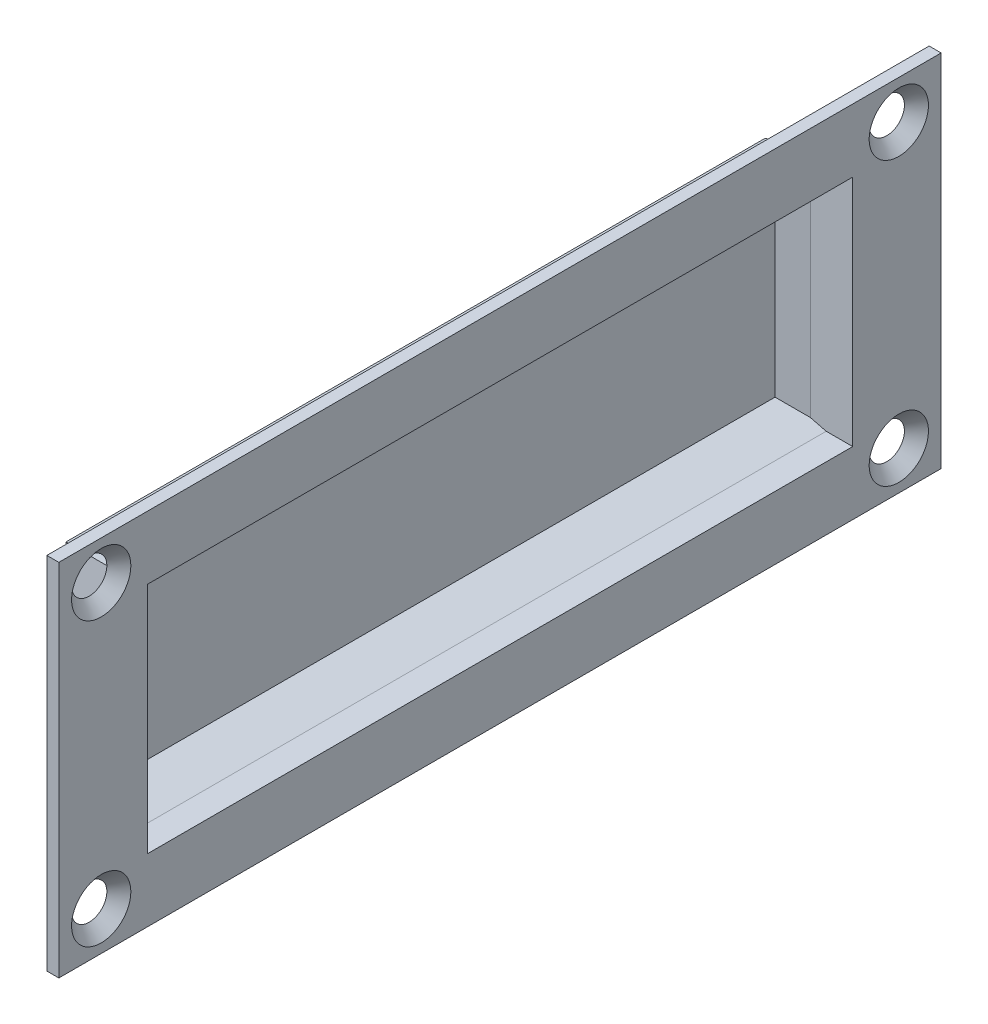
ISO-10303-21;
HEADER;
FILE_DESCRIPTION(('STEP AP214'),'2;1');
FILE_NAME('part.step','',(''),(''),'','','');
FILE_SCHEMA(('AUTOMOTIVE_DESIGN { 1 0 10303 214 1 1 1 1 }'));
ENDSEC;
DATA;
#1=APPLICATION_CONTEXT('core data for automotive mechanical design processes');
#2=APPLICATION_PROTOCOL_DEFINITION('international standard','automotive_design',2000,#1);
#3=PRODUCT_CONTEXT('',#1,'mechanical');
#4=PRODUCT('Part','Part','',(#3));
#5=PRODUCT_RELATED_PRODUCT_CATEGORY('part','',(#4));
#6=PRODUCT_DEFINITION_FORMATION('','',#4);
#7=PRODUCT_DEFINITION_CONTEXT('part definition',#1,'design');
#8=PRODUCT_DEFINITION('design','',#6,#7);
#9=PRODUCT_DEFINITION_SHAPE('','',#8);
#10=(LENGTH_UNIT() NAMED_UNIT(*) SI_UNIT(.MILLI.,.METRE.));
#11=(NAMED_UNIT(*) PLANE_ANGLE_UNIT() SI_UNIT($,.RADIAN.));
#12=(NAMED_UNIT(*) SI_UNIT($,.STERADIAN.) SOLID_ANGLE_UNIT());
#13=UNCERTAINTY_MEASURE_WITH_UNIT(LENGTH_MEASURE(1.E-05),#10,'distance_accuracy_value','');
#14=(GEOMETRIC_REPRESENTATION_CONTEXT(3) GLOBAL_UNCERTAINTY_ASSIGNED_CONTEXT((#13)) GLOBAL_UNIT_ASSIGNED_CONTEXT((#10,
#11,#12)) REPRESENTATION_CONTEXT('',''));
#15=CARTESIAN_POINT('',(0.,0.,0.));
#16=DIRECTION('',(0.,0.,1.));
#17=DIRECTION('',(1.,0.,0.));
#18=AXIS2_PLACEMENT_3D('',#15,#16,#17);
#19=CARTESIAN_POINT('',(-8.,15.5,62.5));
#20=DIRECTION('',(1.,0.,0.));
#21=DIRECTION('',(0.,1.,0.));
#22=AXIS2_PLACEMENT_3D('',#19,#20,#21);
#23=PLANE('',#22);
#24=DIRECTION('',(0.,0.,-1.));
#25=VECTOR('',#24,1.);
#26=CARTESIAN_POINT('',(-8.,-15.5,62.5));
#27=LINE('',#26,#25);
#28=CARTESIAN_POINT('',(-8.,-15.5,49.5));
#29=VERTEX_POINT('',#28);
#30=CARTESIAN_POINT('',(-8.,-15.5,-49.5));
#31=VERTEX_POINT('',#30);
#32=EDGE_CURVE('E41',#29,#31,#27,.T.);
#33=ORIENTED_EDGE('',*,*,#32,.F.);
#34=DIRECTION('',(0.,-1.,0.));
#35=VECTOR('',#34,1.);
#36=CARTESIAN_POINT('',(-8.,47.5,49.5));
#37=LINE('',#36,#35);
#38=CARTESIAN_POINT('',(-8.,15.5,49.5));
#39=VERTEX_POINT('',#38);
#40=EDGE_CURVE('E281',#39,#29,#37,.T.);
#41=ORIENTED_EDGE('',*,*,#40,.F.);
#42=DIRECTION('',(0.,0.,-1.));
#43=VECTOR('',#42,1.);
#44=CARTESIAN_POINT('',(-8.,15.5,62.5));
#45=LINE('',#44,#43);
#46=CARTESIAN_POINT('',(-8.,15.5,-49.5));
#47=VERTEX_POINT('',#46);
#48=EDGE_CURVE('E11',#39,#47,#45,.T.);
#49=ORIENTED_EDGE('',*,*,#48,.T.);
#50=DIRECTION('',(0.,-1.,0.));
#51=VECTOR('',#50,1.);
#52=CARTESIAN_POINT('',(-8.,47.5,-49.5));
#53=LINE('',#52,#51);
#54=EDGE_CURVE('E27',#47,#31,#53,.T.);
#55=ORIENTED_EDGE('',*,*,#54,.T.);
#56=EDGE_LOOP('',(#33,#41,#49,#55));
#57=FACE_BOUND('',#56,.T.);
#58=ADVANCED_FACE('F17',(#57),#23,.F.);
#59=CARTESIAN_POINT('',(2.3,-25.5,62.5));
#60=DIRECTION('',(0.,1.,0.));
#61=DIRECTION('',(1.,0.,0.));
#62=AXIS2_PLACEMENT_3D('',#59,#60,#61);
#63=PLANE('',#62);
#64=DIRECTION('',(0.,0.,-1.));
#65=VECTOR('',#64,1.);
#66=CARTESIAN_POINT('',(2.3,-25.5,62.5));
#67=LINE('',#66,#65);
#68=CARTESIAN_POINT('',(2.3,-25.5,62.5));
#69=VERTEX_POINT('',#68);
#70=CARTESIAN_POINT('',(2.3,-25.5,-62.5));
#71=VERTEX_POINT('',#70);
#72=EDGE_CURVE('E219',#69,#71,#67,.T.);
#73=ORIENTED_EDGE('',*,*,#72,.T.);
#74=DIRECTION('',(1.,0.,0.));
#75=VECTOR('',#74,1.);
#76=CARTESIAN_POINT('',(2.3,-25.5,-62.5));
#77=LINE('',#76,#75);
#78=CARTESIAN_POINT('',(4.,-25.5,-62.5));
#79=VERTEX_POINT('',#78);
#80=EDGE_CURVE('E215',#71,#79,#77,.T.);
#81=ORIENTED_EDGE('',*,*,#80,.T.);
#82=DIRECTION('',(0.,0.,-1.));
#83=VECTOR('',#82,1.);
#84=CARTESIAN_POINT('',(4.,-25.5,62.5));
#85=LINE('',#84,#83);
#86=CARTESIAN_POINT('',(4.,-25.5,62.5));
#87=VERTEX_POINT('',#86);
#88=EDGE_CURVE('E312',#87,#79,#85,.T.);
#89=ORIENTED_EDGE('',*,*,#88,.F.);
#90=DIRECTION('',(1.,0.,0.));
#91=VECTOR('',#90,1.);
#92=CARTESIAN_POINT('',(2.3,-25.5,62.5));
#93=LINE('',#92,#91);
#94=EDGE_CURVE('E190',#69,#87,#93,.T.);
#95=ORIENTED_EDGE('',*,*,#94,.F.);
#96=EDGE_LOOP('',(#73,#81,#89,#95));
#97=FACE_BOUND('',#96,.T.);
#98=ADVANCED_FACE('F435',(#97),#63,.F.);
#99=CARTESIAN_POINT('',(4.,25.5,62.5));
#100=DIRECTION('',(0.,-1.,0.));
#101=DIRECTION('',(0.,0.,-1.));
#102=AXIS2_PLACEMENT_3D('',#99,#100,#101);
#103=PLANE('',#102);
#104=DIRECTION('',(-1.,0.,0.));
#105=VECTOR('',#104,1.);
#106=CARTESIAN_POINT('',(4.,25.5,-62.5));
#107=LINE('',#106,#105);
#108=CARTESIAN_POINT('',(4.,25.5,-62.5));
#109=VERTEX_POINT('',#108);
#110=CARTESIAN_POINT('',(2.3,25.5,-62.5));
#111=VERTEX_POINT('',#110);
#112=EDGE_CURVE('E220',#109,#111,#107,.T.);
#113=ORIENTED_EDGE('',*,*,#112,.T.);
#114=DIRECTION('',(0.,0.,-1.));
#115=VECTOR('',#114,1.);
#116=CARTESIAN_POINT('',(2.3,25.5,62.5));
#117=LINE('',#116,#115);
#118=CARTESIAN_POINT('',(2.3,25.5,62.5));
#119=VERTEX_POINT('',#118);
#120=EDGE_CURVE('E225',#119,#111,#117,.T.);
#121=ORIENTED_EDGE('',*,*,#120,.F.);
#122=DIRECTION('',(-1.,0.,0.));
#123=VECTOR('',#122,1.);
#124=CARTESIAN_POINT('',(4.,25.5,62.5));
#125=LINE('',#124,#123);
#126=CARTESIAN_POINT('',(4.,25.5,62.5));
#127=VERTEX_POINT('',#126);
#128=EDGE_CURVE('E189',#127,#119,#125,.T.);
#129=ORIENTED_EDGE('',*,*,#128,.F.);
#130=DIRECTION('',(0.,0.,-1.));
#131=VECTOR('',#130,1.);
#132=CARTESIAN_POINT('',(4.,25.5,62.5));
#133=LINE('',#132,#131);
#134=EDGE_CURVE('E229',#127,#109,#133,.T.);
#135=ORIENTED_EDGE('',*,*,#134,.T.);
#136=EDGE_LOOP('',(#113,#121,#129,#135));
#137=FACE_BOUND('',#136,.T.);
#138=ADVANCED_FACE('F430',(#137),#103,.F.);
#139=CARTESIAN_POINT('',(-8.,47.5,-49.5));
#140=DIRECTION('',(-0.242535625036333,0.,-0.970142500145332));
#141=DIRECTION('',(-0.970142500145332,0.,0.242535625036333));
#142=AXIS2_PLACEMENT_3D('',#139,#140,#141);
#143=PLANE('',#142);
#144=DIRECTION('',(0.,-1.,0.));
#145=VECTOR('',#144,1.);
#146=CARTESIAN_POINT('',(2.3,47.5,-52.075));
#147=LINE('',#146,#145);
#148=CARTESIAN_POINT('',(2.3,18.075,-52.075));
#149=VERTEX_POINT('',#148);
#150=CARTESIAN_POINT('',(2.3,-18.075,-52.075));
#151=VERTEX_POINT('',#150);
#152=EDGE_CURVE('E201',#149,#151,#147,.T.);
#153=ORIENTED_EDGE('',*,*,#152,.T.);
#154=DIRECTION('',(-0.942809041582063,0.235702260395516,0.235702260395516));
#155=VECTOR('',#154,1.);
#156=CARTESIAN_POINT('',(-22.,-12.,-46.));
#157=LINE('',#156,#155);
#158=EDGE_CURVE('E197',#151,#31,#157,.T.);
#159=ORIENTED_EDGE('',*,*,#158,.T.);
#160=ORIENTED_EDGE('',*,*,#54,.F.);
#161=DIRECTION('',(0.942809041582063,0.235702260395516,-0.235702260395516));
#162=VECTOR('',#161,1.);
#163=CARTESIAN_POINT('',(-0.888888888888888,17.2777777777778,-51.2777777777778));
#164=LINE('',#163,#162);
#165=EDGE_CURVE('E202',#47,#149,#164,.T.);
#166=ORIENTED_EDGE('',*,*,#165,.T.);
#167=EDGE_LOOP('',(#153,#159,#160,#166));
#168=FACE_BOUND('',#167,.T.);
#169=ADVANCED_FACE('F459',(#168),#143,.T.);
#170=CARTESIAN_POINT('',(2.3,47.5,52.075));
#171=DIRECTION('',(-0.242535625036333,0.,0.970142500145332));
#172=DIRECTION('',(0.,1.,0.));
#173=AXIS2_PLACEMENT_3D('',#170,#171,#172);
#174=PLANE('',#173);
#175=ORIENTED_EDGE('',*,*,#40,.T.);
#176=DIRECTION('',(0.942809041582063,-0.235702260395516,0.235702260395516));
#177=VECTOR('',#176,1.);
#178=CARTESIAN_POINT('',(-12.2722222222222,-14.4319444444444,48.4319444444444));
#179=LINE('',#178,#177);
#180=CARTESIAN_POINT('',(2.3,-18.075,52.075));
#181=VERTEX_POINT('',#180);
#182=EDGE_CURVE('E277',#29,#181,#179,.T.);
#183=ORIENTED_EDGE('',*,*,#182,.T.);
#184=DIRECTION('',(0.,-1.,0.));
#185=VECTOR('',#184,1.);
#186=CARTESIAN_POINT('',(2.3,47.5,52.075));
#187=LINE('',#186,#185);
#188=CARTESIAN_POINT('',(2.3,18.075,52.075));
#189=VERTEX_POINT('',#188);
#190=EDGE_CURVE('E173',#189,#181,#187,.T.);
#191=ORIENTED_EDGE('',*,*,#190,.F.);
#192=DIRECTION('',(-0.942809041582063,-0.235702260395516,-0.235702260395516));
#193=VECTOR('',#192,1.);
#194=CARTESIAN_POINT('',(8.83888888888889,19.7097222222222,53.7097222222222));
#195=LINE('',#194,#193);
#196=EDGE_CURVE('E282',#189,#39,#195,.T.);
#197=ORIENTED_EDGE('',*,*,#196,.T.);
#198=EDGE_LOOP('',(#175,#183,#191,#197));
#199=FACE_BOUND('',#198,.T.);
#200=ADVANCED_FACE('F463',(#199),#174,.T.);
#201=CARTESIAN_POINT('',(-8.,-15.5,62.5));
#202=DIRECTION('',(0.242535625036333,0.970142500145332,0.));
#203=DIRECTION('',(0.,0.,-1.));
#204=AXIS2_PLACEMENT_3D('',#201,#202,#203);
#205=PLANE('',#204);
#206=DIRECTION('',(0.,0.,-1.));
#207=VECTOR('',#206,1.);
#208=CARTESIAN_POINT('',(2.3,-18.075,62.5));
#209=LINE('',#208,#207);
#210=EDGE_CURVE('E205',#181,#151,#209,.T.);
#211=ORIENTED_EDGE('',*,*,#210,.F.);
#212=ORIENTED_EDGE('',*,*,#182,.F.);
#213=ORIENTED_EDGE('',*,*,#32,.T.);
#214=ORIENTED_EDGE('',*,*,#158,.F.);
#215=EDGE_LOOP('',(#211,#212,#213,#214));
#216=FACE_BOUND('',#215,.T.);
#217=ADVANCED_FACE('F503',(#216),#205,.F.);
#218=CARTESIAN_POINT('',(4.,-16.5307235935956,62.5));
#219=DIRECTION('',(0.,-1.,0.));
#220=DIRECTION('',(0.,0.,-1.));
#221=AXIS2_PLACEMENT_3D('',#218,#219,#220);
#222=PLANE('',#221);
#223=DIRECTION('',(-1.,0.,0.));
#224=VECTOR('',#223,1.);
#225=CARTESIAN_POINT('',(4.,-16.5307235935956,49.9692235935956));
#226=LINE('',#225,#224);
#227=CARTESIAN_POINT('',(4.,-16.5307235935956,49.9692235935956));
#228=VERTEX_POINT('',#227);
#229=CARTESIAN_POINT('',(0.245999999999986,-16.5307235935956,49.9692235935956));
#230=VERTEX_POINT('',#229);
#231=EDGE_CURVE('E246',#228,#230,#226,.T.);
#232=ORIENTED_EDGE('',*,*,#231,.F.);
#233=DIRECTION('',(0.,0.,-1.));
#234=VECTOR('',#233,1.);
#235=CARTESIAN_POINT('',(4.,-16.5307235935956,62.5));
#236=LINE('',#235,#234);
#237=CARTESIAN_POINT('',(4.,-16.5307235935956,-49.9692235935956));
#238=VERTEX_POINT('',#237);
#239=EDGE_CURVE('E238',#228,#238,#236,.T.);
#240=ORIENTED_EDGE('',*,*,#239,.T.);
#241=DIRECTION('',(1.,0.,0.));
#242=VECTOR('',#241,1.);
#243=CARTESIAN_POINT('',(4.,-16.5307235935956,-49.9692235935956));
#244=LINE('',#243,#242);
#245=CARTESIAN_POINT('',(0.245999999999986,-16.5307235935956,-49.9692235935956));
#246=VERTEX_POINT('',#245);
#247=EDGE_CURVE('E20',#246,#238,#244,.T.);
#248=ORIENTED_EDGE('',*,*,#247,.F.);
#249=DIRECTION('',(0.,0.,-1.));
#250=VECTOR('',#249,1.);
#251=CARTESIAN_POINT('',(0.245999999999986,-16.5307235935956,62.5));
#252=LINE('',#251,#250);
#253=EDGE_CURVE('E183',#230,#246,#252,.T.);
#254=ORIENTED_EDGE('',*,*,#253,.F.);
#255=EDGE_LOOP('',(#232,#240,#248,#254));
#256=FACE_BOUND('',#255,.T.);
#257=ADVANCED_FACE('F388',(#256),#222,.F.);
#258=CARTESIAN_POINT('',(0.245999999999986,-16.5307235935956,62.5));
#259=DIRECTION('',(-0.242535625036334,-0.970142500145332,0.));
#260=DIRECTION('',(-0.970142500145332,0.242535625036334,0.));
#261=AXIS2_PLACEMENT_3D('',#258,#259,#260);
#262=PLANE('',#261);
#263=DIRECTION('',(-0.970142500145332,0.242535625036334,0.));
#264=VECTOR('',#263,1.);
#265=CARTESIAN_POINT('',(0.245999999999986,-16.5307235935956,49.9692235935956));
#266=LINE('',#265,#264);
#267=CARTESIAN_POINT('',(-2.,-15.9692235935956,49.9692235935956));
#268=VERTEX_POINT('',#267);
#269=EDGE_CURVE('E210',#230,#268,#266,.T.);
#270=ORIENTED_EDGE('',*,*,#269,.F.);
#271=ORIENTED_EDGE('',*,*,#253,.T.);
#272=DIRECTION('',(0.970142500145332,-0.242535625036334,0.));
#273=VECTOR('',#272,1.);
#274=CARTESIAN_POINT('',(0.245999999999986,-16.5307235935956,-49.9692235935956));
#275=LINE('',#274,#273);
#276=CARTESIAN_POINT('',(-2.,-15.9692235935956,-49.9692235935956));
#277=VERTEX_POINT('',#276);
#278=EDGE_CURVE('E176',#277,#246,#275,.T.);
#279=ORIENTED_EDGE('',*,*,#278,.F.);
#280=DIRECTION('',(0.942809041582063,-0.235702260395516,-0.235702260395516));
#281=VECTOR('',#280,1.);
#282=CARTESIAN_POINT('',(-24.8719385763546,-10.2512389495069,-44.2512389495069));
#283=LINE('',#282,#281);
#284=CARTESIAN_POINT('',(-6.,-14.9692235935956,-48.9692235935956));
#285=VERTEX_POINT('',#284);
#286=EDGE_CURVE('E273',#285,#277,#283,.T.);
#287=ORIENTED_EDGE('',*,*,#286,.F.);
#288=DIRECTION('',(0.,0.,-1.));
#289=VECTOR('',#288,1.);
#290=CARTESIAN_POINT('',(-6.,-14.9692235935956,62.5));
#291=LINE('',#290,#289);
#292=CARTESIAN_POINT('',(-6.,-14.9692235935956,48.9692235935956));
#293=VERTEX_POINT('',#292);
#294=EDGE_CURVE('E184',#293,#285,#291,.T.);
#295=ORIENTED_EDGE('',*,*,#294,.F.);
#296=DIRECTION('',(-0.942809041582063,0.235702260395516,-0.235702260395516));
#297=VECTOR('',#296,1.);
#298=CARTESIAN_POINT('',(2.90583920142319,-17.1956833939514,51.1956833939514));
#299=LINE('',#298,#297);
#300=EDGE_CURVE('E267',#268,#293,#299,.T.);
#301=ORIENTED_EDGE('',*,*,#300,.F.);
#302=EDGE_LOOP('',(#270,#271,#279,#287,#295,#301));
#303=FACE_BOUND('',#302,.T.);
#304=ADVANCED_FACE('F510',(#303),#262,.F.);
#305=CARTESIAN_POINT('',(-6.,-14.9692235935956,62.5));
#306=DIRECTION('',(-1.,0.,0.));
#307=DIRECTION('',(0.,0.,1.));
#308=AXIS2_PLACEMENT_3D('',#305,#306,#307);
#309=PLANE('',#308);
#310=DIRECTION('',(0.,-1.,0.));
#311=VECTOR('',#310,1.);
#312=CARTESIAN_POINT('',(-6.,25.5,48.9692235935956));
#313=LINE('',#312,#311);
#314=CARTESIAN_POINT('',(-6.,14.9692235935956,48.9692235935956));
#315=VERTEX_POINT('',#314);
#316=EDGE_CURVE('E179',#315,#293,#313,.T.);
#317=ORIENTED_EDGE('',*,*,#316,.T.);
#318=ORIENTED_EDGE('',*,*,#294,.T.);
#319=DIRECTION('',(0.,-1.,0.));
#320=VECTOR('',#319,1.);
#321=CARTESIAN_POINT('',(-6.,25.5,-48.9692235935956));
#322=LINE('',#321,#320);
#323=CARTESIAN_POINT('',(-6.,14.9692235935956,-48.9692235935956));
#324=VERTEX_POINT('',#323);
#325=EDGE_CURVE('E276',#324,#285,#322,.T.);
#326=ORIENTED_EDGE('',*,*,#325,.F.);
#327=DIRECTION('',(0.,0.,-1.));
#328=VECTOR('',#327,1.);
#329=CARTESIAN_POINT('',(-6.,14.9692235935956,62.5));
#330=LINE('',#329,#328);
#331=EDGE_CURVE('E214',#315,#324,#330,.T.);
#332=ORIENTED_EDGE('',*,*,#331,.F.);
#333=EDGE_LOOP('',(#317,#318,#326,#332));
#334=FACE_BOUND('',#333,.T.);
#335=ADVANCED_FACE('F519',(#334),#309,.F.);
#336=CARTESIAN_POINT('',(-6.,14.9692235935956,62.5));
#337=DIRECTION('',(-0.242535625036334,0.970142500145332,0.));
#338=DIRECTION('',(0.,0.,1.));
#339=AXIS2_PLACEMENT_3D('',#336,#337,#338);
#340=PLANE('',#339);
#341=DIRECTION('',(0.970142500145332,0.242535625036334,0.));
#342=VECTOR('',#341,1.);
#343=CARTESIAN_POINT('',(-6.,14.9692235935956,49.9692235935956));
#344=LINE('',#343,#342);
#345=CARTESIAN_POINT('',(-2.,15.9692235935956,49.9692235935956));
#346=VERTEX_POINT('',#345);
#347=CARTESIAN_POINT('',(0.246000000000011,16.5307235935956,49.9692235935956));
#348=VERTEX_POINT('',#347);
#349=EDGE_CURVE('E206',#346,#348,#344,.T.);
#350=ORIENTED_EDGE('',*,*,#349,.F.);
#351=DIRECTION('',(0.942809041582063,0.235702260395516,0.235702260395516));
#352=VECTOR('',#351,1.);
#353=CARTESIAN_POINT('',(-2.9931607985768,15.7209333939514,49.7209333939514));
#354=LINE('',#353,#352);
#355=EDGE_CURVE('E245',#315,#346,#354,.T.);
#356=ORIENTED_EDGE('',*,*,#355,.F.);
#357=ORIENTED_EDGE('',*,*,#331,.T.);
#358=DIRECTION('',(-0.942809041582063,-0.235702260395516,0.235702260395516));
#359=VECTOR('',#358,1.);
#360=CARTESIAN_POINT('',(-30.7709385763546,8.77648894950692,-42.7764889495069));
#361=LINE('',#360,#359);
#362=CARTESIAN_POINT('',(-2.,15.9692235935956,-49.9692235935956));
#363=VERTEX_POINT('',#362);
#364=EDGE_CURVE('E266',#363,#324,#361,.T.);
#365=ORIENTED_EDGE('',*,*,#364,.F.);
#366=DIRECTION('',(-0.970142500145332,-0.242535625036334,0.));
#367=VECTOR('',#366,1.);
#368=CARTESIAN_POINT('',(-6.,14.9692235935956,-49.9692235935956));
#369=LINE('',#368,#367);
#370=CARTESIAN_POINT('',(0.246000000000011,16.5307235935956,-49.9692235935956));
#371=VERTEX_POINT('',#370);
#372=EDGE_CURVE('E252',#371,#363,#369,.T.);
#373=ORIENTED_EDGE('',*,*,#372,.F.);
#374=DIRECTION('',(0.,0.,-1.));
#375=VECTOR('',#374,1.);
#376=CARTESIAN_POINT('',(0.246000000000011,16.5307235935956,62.5));
#377=LINE('',#376,#375);
#378=EDGE_CURVE('E234',#348,#371,#377,.T.);
#379=ORIENTED_EDGE('',*,*,#378,.F.);
#380=EDGE_LOOP('',(#350,#356,#357,#365,#373,#379));
#381=FACE_BOUND('',#380,.T.);
#382=ADVANCED_FACE('F480',(#381),#340,.F.);
#383=CARTESIAN_POINT('',(0.246000000000012,16.5307235935956,62.5));
#384=DIRECTION('',(0.,1.,0.));
#385=DIRECTION('',(1.,0.,0.));
#386=AXIS2_PLACEMENT_3D('',#383,#384,#385);
#387=PLANE('',#386);
#388=DIRECTION('',(1.,0.,0.));
#389=VECTOR('',#388,1.);
#390=CARTESIAN_POINT('',(0.246000000000012,16.5307235935956,49.9692235935956));
#391=LINE('',#390,#389);
#392=CARTESIAN_POINT('',(4.,16.5307235935956,49.9692235935956));
#393=VERTEX_POINT('',#392);
#394=EDGE_CURVE('E195',#348,#393,#391,.T.);
#395=ORIENTED_EDGE('',*,*,#394,.F.);
#396=ORIENTED_EDGE('',*,*,#378,.T.);
#397=DIRECTION('',(-1.,0.,0.));
#398=VECTOR('',#397,1.);
#399=CARTESIAN_POINT('',(0.246000000000012,16.5307235935956,-49.9692235935956));
#400=LINE('',#399,#398);
#401=CARTESIAN_POINT('',(4.,16.5307235935956,-49.9692235935956));
#402=VERTEX_POINT('',#401);
#403=EDGE_CURVE('E248',#402,#371,#400,.T.);
#404=ORIENTED_EDGE('',*,*,#403,.F.);
#405=DIRECTION('',(0.,0.,-1.));
#406=VECTOR('',#405,1.);
#407=CARTESIAN_POINT('',(4.,16.5307235935956,62.5));
#408=LINE('',#407,#406);
#409=EDGE_CURVE('E286',#393,#402,#408,.T.);
#410=ORIENTED_EDGE('',*,*,#409,.F.);
#411=EDGE_LOOP('',(#395,#396,#404,#410));
#412=FACE_BOUND('',#411,.T.);
#413=ADVANCED_FACE('F381',(#412),#387,.F.);
#414=CARTESIAN_POINT('',(2.3,18.075,62.5));
#415=DIRECTION('',(0.242535625036333,-0.970142500145332,0.));
#416=DIRECTION('',(0.,0.,-1.));
#417=AXIS2_PLACEMENT_3D('',#414,#415,#416);
#418=PLANE('',#417);
#419=DIRECTION('',(0.,0.,-1.));
#420=VECTOR('',#419,1.);
#421=CARTESIAN_POINT('',(2.3,18.075,62.5));
#422=LINE('',#421,#420);
#423=EDGE_CURVE('E233',#189,#149,#422,.T.);
#424=ORIENTED_EDGE('',*,*,#423,.T.);
#425=ORIENTED_EDGE('',*,*,#165,.F.);
#426=ORIENTED_EDGE('',*,*,#48,.F.);
#427=ORIENTED_EDGE('',*,*,#196,.F.);
#428=EDGE_LOOP('',(#424,#425,#426,#427));
#429=FACE_BOUND('',#428,.T.);
#430=ADVANCED_FACE('F471',(#429),#418,.F.);
#431=CARTESIAN_POINT('',(2.3,25.5,62.5));
#432=DIRECTION('',(1.,0.,0.));
#433=DIRECTION('',(0.,1.,0.));
#434=AXIS2_PLACEMENT_3D('',#431,#432,#433);
#435=PLANE('',#434);
#436=CARTESIAN_POINT('',(2.3,-20.,-56.5));
#437=DIRECTION('',(1.,0.,0.));
#438=DIRECTION('',(0.,1.,0.));
#439=AXIS2_PLACEMENT_3D('',#436,#437,#438);
#440=CIRCLE('',#439,2.5);
#441=CARTESIAN_POINT('',(2.3,-17.5,-56.5));
#442=VERTEX_POINT('',#441);
#443=EDGE_CURVE('E169',#442,#442,#440,.T.);
#444=ORIENTED_EDGE('',*,*,#443,.T.);
#445=EDGE_LOOP('',(#444));
#446=FACE_BOUND('',#445,.T.);
#447=CARTESIAN_POINT('',(2.3,20.,-56.5));
#448=DIRECTION('',(1.,0.,0.));
#449=DIRECTION('',(0.,0.,-1.));
#450=AXIS2_PLACEMENT_3D('',#447,#448,#449);
#451=CIRCLE('',#450,2.5);
#452=CARTESIAN_POINT('',(2.3,20.,-59.));
#453=VERTEX_POINT('',#452);
#454=EDGE_CURVE('E154',#453,#453,#451,.T.);
#455=ORIENTED_EDGE('',*,*,#454,.T.);
#456=EDGE_LOOP('',(#455));
#457=FACE_BOUND('',#456,.T.);
#458=CARTESIAN_POINT('',(2.3,-20.,56.5));
#459=DIRECTION('',(1.,0.,0.));
#460=DIRECTION('',(0.,1.,0.));
#461=AXIS2_PLACEMENT_3D('',#458,#459,#460);
#462=CIRCLE('',#461,2.5);
#463=CARTESIAN_POINT('',(2.3,-17.5,56.5));
#464=VERTEX_POINT('',#463);
#465=EDGE_CURVE('E160',#464,#464,#462,.T.);
#466=ORIENTED_EDGE('',*,*,#465,.T.);
#467=EDGE_LOOP('',(#466));
#468=FACE_BOUND('',#467,.T.);
#469=CARTESIAN_POINT('',(2.3,20.,56.5));
#470=DIRECTION('',(1.,0.,0.));
#471=DIRECTION('',(0.,0.,-1.));
#472=AXIS2_PLACEMENT_3D('',#469,#470,#471);
#473=CIRCLE('',#472,2.5);
#474=CARTESIAN_POINT('',(2.3,20.,54.));
#475=VERTEX_POINT('',#474);
#476=EDGE_CURVE('E164',#475,#475,#473,.T.);
#477=ORIENTED_EDGE('',*,*,#476,.T.);
#478=EDGE_LOOP('',(#477));
#479=FACE_BOUND('',#478,.T.);
#480=ORIENTED_EDGE('',*,*,#190,.T.);
#481=ORIENTED_EDGE('',*,*,#210,.T.);
#482=ORIENTED_EDGE('',*,*,#152,.F.);
#483=ORIENTED_EDGE('',*,*,#423,.F.);
#484=EDGE_LOOP('',(#480,#481,#482,#483));
#485=FACE_BOUND('',#484,.T.);
#486=DIRECTION('',(0.,-1.,0.));
#487=VECTOR('',#486,1.);
#488=CARTESIAN_POINT('',(2.3,25.5,-62.5));
#489=LINE('',#488,#487);
#490=EDGE_CURVE('E221',#111,#71,#489,.T.);
#491=ORIENTED_EDGE('',*,*,#490,.T.);
#492=ORIENTED_EDGE('',*,*,#72,.F.);
#493=DIRECTION('',(0.,-1.,0.));
#494=VECTOR('',#493,1.);
#495=CARTESIAN_POINT('',(2.3,-18.075,62.5));
#496=LINE('',#495,#494);
#497=EDGE_CURVE('E185',#119,#69,#496,.T.);
#498=ORIENTED_EDGE('',*,*,#497,.F.);
#499=ORIENTED_EDGE('',*,*,#120,.T.);
#500=EDGE_LOOP('',(#491,#492,#498,#499));
#501=FACE_BOUND('',#500,.T.);
#502=ADVANCED_FACE('F434',(#446,#457,#468,#479,#485,#501),#435,.F.);
#503=CARTESIAN_POINT('',(0.,0.,62.5));
#504=DIRECTION('',(0.,0.,1.));
#505=DIRECTION('',(1.,0.,0.));
#506=AXIS2_PLACEMENT_3D('',#503,#504,#505);
#507=PLANE('',#506);
#508=DIRECTION('',(0.,1.,0.));
#509=VECTOR('',#508,1.);
#510=CARTESIAN_POINT('',(4.,-25.5,62.5));
#511=LINE('',#510,#509);
#512=EDGE_CURVE('E317',#87,#127,#511,.T.);
#513=ORIENTED_EDGE('',*,*,#512,.T.);
#514=ORIENTED_EDGE('',*,*,#128,.T.);
#515=ORIENTED_EDGE('',*,*,#497,.T.);
#516=ORIENTED_EDGE('',*,*,#94,.T.);
#517=EDGE_LOOP('',(#513,#514,#515,#516));
#518=FACE_BOUND('',#517,.T.);
#519=ADVANCED_FACE('F348',(#518),#507,.T.);
#520=CARTESIAN_POINT('',(0.,0.,-62.5));
#521=DIRECTION('',(0.,0.,1.));
#522=DIRECTION('',(1.,0.,0.));
#523=AXIS2_PLACEMENT_3D('',#520,#521,#522);
#524=PLANE('',#523);
#525=ORIENTED_EDGE('',*,*,#80,.F.);
#526=ORIENTED_EDGE('',*,*,#490,.F.);
#527=ORIENTED_EDGE('',*,*,#112,.F.);
#528=DIRECTION('',(0.,1.,0.));
#529=VECTOR('',#528,1.);
#530=CARTESIAN_POINT('',(4.,16.5307235935956,-62.5));
#531=LINE('',#530,#529);
#532=EDGE_CURVE('E309',#79,#109,#531,.T.);
#533=ORIENTED_EDGE('',*,*,#532,.F.);
#534=EDGE_LOOP('',(#525,#526,#527,#533));
#535=FACE_BOUND('',#534,.T.);
#536=ADVANCED_FACE('F438',(#535),#524,.F.);
#537=CARTESIAN_POINT('',(4.,16.5307235935956,62.5));
#538=DIRECTION('',(-1.,0.,0.));
#539=DIRECTION('',(0.,0.,1.));
#540=AXIS2_PLACEMENT_3D('',#537,#538,#539);
#541=PLANE('',#540);
#542=CARTESIAN_POINT('',(4.,-20.,-56.5));
#543=DIRECTION('',(1.,0.,0.));
#544=DIRECTION('',(0.,1.,0.));
#545=AXIS2_PLACEMENT_3D('',#542,#543,#544);
#546=CIRCLE('',#545,4.2);
#547=CARTESIAN_POINT('',(4.,-15.8,-56.5));
#548=VERTEX_POINT('',#547);
#549=EDGE_CURVE('E125',#548,#548,#546,.T.);
#550=ORIENTED_EDGE('',*,*,#549,.F.);
#551=EDGE_LOOP('',(#550));
#552=FACE_BOUND('',#551,.T.);
#553=CARTESIAN_POINT('',(4.,20.,-56.5));
#554=DIRECTION('',(1.,0.,0.));
#555=DIRECTION('',(0.,0.,-1.));
#556=AXIS2_PLACEMENT_3D('',#553,#554,#555);
#557=CIRCLE('',#556,4.2);
#558=CARTESIAN_POINT('',(4.,20.,-60.7));
#559=VERTEX_POINT('',#558);
#560=EDGE_CURVE('E138',#559,#559,#557,.T.);
#561=ORIENTED_EDGE('',*,*,#560,.F.);
#562=EDGE_LOOP('',(#561));
#563=FACE_BOUND('',#562,.T.);
#564=CARTESIAN_POINT('',(4.,-20.,56.5));
#565=DIRECTION('',(1.,0.,0.));
#566=DIRECTION('',(0.,1.,0.));
#567=AXIS2_PLACEMENT_3D('',#564,#565,#566);
#568=CIRCLE('',#567,4.2);
#569=CARTESIAN_POINT('',(4.,-15.8,56.5));
#570=VERTEX_POINT('',#569);
#571=EDGE_CURVE('E196',#570,#570,#568,.T.);
#572=ORIENTED_EDGE('',*,*,#571,.F.);
#573=EDGE_LOOP('',(#572));
#574=FACE_BOUND('',#573,.T.);
#575=CARTESIAN_POINT('',(4.,20.,56.5));
#576=DIRECTION('',(1.,0.,0.));
#577=DIRECTION('',(0.,0.,-1.));
#578=AXIS2_PLACEMENT_3D('',#575,#576,#577);
#579=CIRCLE('',#578,4.2);
#580=CARTESIAN_POINT('',(4.,20.,52.3));
#581=VERTEX_POINT('',#580);
#582=EDGE_CURVE('E191',#581,#581,#579,.T.);
#583=ORIENTED_EDGE('',*,*,#582,.F.);
#584=EDGE_LOOP('',(#583));
#585=FACE_BOUND('',#584,.T.);
#586=ORIENTED_EDGE('',*,*,#239,.F.);
#587=DIRECTION('',(0.,-1.,0.));
#588=VECTOR('',#587,1.);
#589=CARTESIAN_POINT('',(4.,25.5,49.9692235935956));
#590=LINE('',#589,#588);
#591=EDGE_CURVE('E242',#393,#228,#590,.T.);
#592=ORIENTED_EDGE('',*,*,#591,.F.);
#593=ORIENTED_EDGE('',*,*,#409,.T.);
#594=DIRECTION('',(0.,-1.,0.));
#595=VECTOR('',#594,1.);
#596=CARTESIAN_POINT('',(4.,25.5,-49.9692235935956));
#597=LINE('',#596,#595);
#598=EDGE_CURVE('E289',#402,#238,#597,.T.);
#599=ORIENTED_EDGE('',*,*,#598,.T.);
#600=EDGE_LOOP('',(#586,#592,#593,#599));
#601=FACE_BOUND('',#600,.T.);
#602=ORIENTED_EDGE('',*,*,#532,.T.);
#603=ORIENTED_EDGE('',*,*,#134,.F.);
#604=ORIENTED_EDGE('',*,*,#512,.F.);
#605=ORIENTED_EDGE('',*,*,#88,.T.);
#606=EDGE_LOOP('',(#602,#603,#604,#605));
#607=FACE_BOUND('',#606,.T.);
#608=ADVANCED_FACE('F356',(#552,#563,#574,#585,#601,#607),#541,.F.);
#609=CARTESIAN_POINT('',(-2.,25.5,-49.9692235935956));
#610=DIRECTION('',(0.,0.,-1.));
#611=DIRECTION('',(0.,-1.,0.));
#612=AXIS2_PLACEMENT_3D('',#609,#610,#611);
#613=PLANE('',#612);
#614=ORIENTED_EDGE('',*,*,#278,.T.);
#615=ORIENTED_EDGE('',*,*,#247,.T.);
#616=ORIENTED_EDGE('',*,*,#598,.F.);
#617=ORIENTED_EDGE('',*,*,#403,.T.);
#618=ORIENTED_EDGE('',*,*,#372,.T.);
#619=DIRECTION('',(0.,-1.,0.));
#620=VECTOR('',#619,1.);
#621=CARTESIAN_POINT('',(-2.,25.5,-49.9692235935956));
#622=LINE('',#621,#620);
#623=EDGE_CURVE('E272',#363,#277,#622,.T.);
#624=ORIENTED_EDGE('',*,*,#623,.T.);
#625=EDGE_LOOP('',(#614,#615,#616,#617,#618,#624));
#626=FACE_BOUND('',#625,.T.);
#627=ADVANCED_FACE('F446',(#626),#613,.F.);
#628=CARTESIAN_POINT('',(-6.,25.5,-48.9692235935956));
#629=DIRECTION('',(-0.242535625036333,0.,-0.970142500145332));
#630=DIRECTION('',(-0.970142500145332,0.,0.242535625036333));
#631=AXIS2_PLACEMENT_3D('',#628,#629,#630);
#632=PLANE('',#631);
#633=ORIENTED_EDGE('',*,*,#325,.T.);
#634=ORIENTED_EDGE('',*,*,#286,.T.);
#635=ORIENTED_EDGE('',*,*,#623,.F.);
#636=ORIENTED_EDGE('',*,*,#364,.T.);
#637=EDGE_LOOP('',(#633,#634,#635,#636));
#638=FACE_BOUND('',#637,.T.);
#639=ADVANCED_FACE('F465',(#638),#632,.F.);
#640=CARTESIAN_POINT('',(-2.,25.5,49.9692235935956));
#641=DIRECTION('',(-0.242535625036333,0.,0.970142500145332));
#642=DIRECTION('',(0.,1.,0.));
#643=AXIS2_PLACEMENT_3D('',#640,#641,#642);
#644=PLANE('',#643);
#645=DIRECTION('',(0.,-1.,0.));
#646=VECTOR('',#645,1.);
#647=CARTESIAN_POINT('',(-2.,25.5,49.9692235935956));
#648=LINE('',#647,#646);
#649=EDGE_CURVE('E263',#346,#268,#648,.T.);
#650=ORIENTED_EDGE('',*,*,#649,.T.);
#651=ORIENTED_EDGE('',*,*,#300,.T.);
#652=ORIENTED_EDGE('',*,*,#316,.F.);
#653=ORIENTED_EDGE('',*,*,#355,.T.);
#654=EDGE_LOOP('',(#650,#651,#652,#653));
#655=FACE_BOUND('',#654,.T.);
#656=ADVANCED_FACE('F467',(#655),#644,.F.);
#657=CARTESIAN_POINT('',(4.,25.5,49.9692235935956));
#658=DIRECTION('',(0.,0.,1.));
#659=DIRECTION('',(1.,0.,0.));
#660=AXIS2_PLACEMENT_3D('',#657,#658,#659);
#661=PLANE('',#660);
#662=ORIENTED_EDGE('',*,*,#591,.T.);
#663=ORIENTED_EDGE('',*,*,#231,.T.);
#664=ORIENTED_EDGE('',*,*,#269,.T.);
#665=ORIENTED_EDGE('',*,*,#649,.F.);
#666=ORIENTED_EDGE('',*,*,#349,.T.);
#667=ORIENTED_EDGE('',*,*,#394,.T.);
#668=EDGE_LOOP('',(#662,#663,#664,#665,#666,#667));
#669=FACE_BOUND('',#668,.T.);
#670=ADVANCED_FACE('F373',(#669),#661,.F.);
#671=CARTESIAN_POINT('',(2.3,20.,56.5));
#672=DIRECTION('',(1.,0.,0.));
#673=DIRECTION('',(0.,0.,-1.));
#674=AXIS2_PLACEMENT_3D('',#671,#672,#673);
#675=CONICAL_SURFACE('',#674,2.5,0.785398163397446);
#676=ORIENTED_EDGE('',*,*,#582,.T.);
#677=EDGE_LOOP('',(#676));
#678=FACE_BOUND('',#677,.T.);
#679=ORIENTED_EDGE('',*,*,#476,.F.);
#680=EDGE_LOOP('',(#679));
#681=FACE_BOUND('',#680,.T.);
#682=ADVANCED_FACE('F575',(#678,#681),#675,.F.);
#683=CARTESIAN_POINT('',(2.3,-20.,56.5));
#684=DIRECTION('',(1.,0.,0.));
#685=DIRECTION('',(0.,1.,0.));
#686=AXIS2_PLACEMENT_3D('',#683,#684,#685);
#687=CONICAL_SURFACE('',#686,2.5,0.785398163397447);
#688=ORIENTED_EDGE('',*,*,#571,.T.);
#689=EDGE_LOOP('',(#688));
#690=FACE_BOUND('',#689,.T.);
#691=ORIENTED_EDGE('',*,*,#465,.F.);
#692=EDGE_LOOP('',(#691));
#693=FACE_BOUND('',#692,.T.);
#694=ADVANCED_FACE('F161',(#690,#693),#687,.F.);
#695=CARTESIAN_POINT('',(2.3,20.,-56.5));
#696=DIRECTION('',(1.,0.,0.));
#697=DIRECTION('',(0.,0.,-1.));
#698=AXIS2_PLACEMENT_3D('',#695,#696,#697);
#699=CONICAL_SURFACE('',#698,2.5,0.78539816339745);
#700=ORIENTED_EDGE('',*,*,#560,.T.);
#701=EDGE_LOOP('',(#700));
#702=FACE_BOUND('',#701,.T.);
#703=ORIENTED_EDGE('',*,*,#454,.F.);
#704=EDGE_LOOP('',(#703));
#705=FACE_BOUND('',#704,.T.);
#706=ADVANCED_FACE('F515',(#702,#705),#699,.F.);
#707=CARTESIAN_POINT('',(2.3,-20.,-56.5));
#708=DIRECTION('',(1.,0.,0.));
#709=DIRECTION('',(0.,1.,0.));
#710=AXIS2_PLACEMENT_3D('',#707,#708,#709);
#711=CONICAL_SURFACE('',#710,2.5,0.785398163397447);
#712=ORIENTED_EDGE('',*,*,#549,.T.);
#713=EDGE_LOOP('',(#712));
#714=FACE_BOUND('',#713,.T.);
#715=ORIENTED_EDGE('',*,*,#443,.F.);
#716=EDGE_LOOP('',(#715));
#717=FACE_BOUND('',#716,.T.);
#718=ADVANCED_FACE('F517',(#714,#717),#711,.F.);
#719=CLOSED_SHELL('',(#58,#98,#138,#169,#200,#217,#257,#304,#335,#382,#413,#430,#502,#519,#536,
#608,#627,#639,#656,#670,#682,#694,#706,#718));
#720=MANIFOLD_SOLID_BREP('B1',#719);
#721=ADVANCED_BREP_SHAPE_REPRESENTATION('',(#18,#720),#14);
#722=SHAPE_DEFINITION_REPRESENTATION(#9,#721);
ENDSEC;
END-ISO-10303-21;
